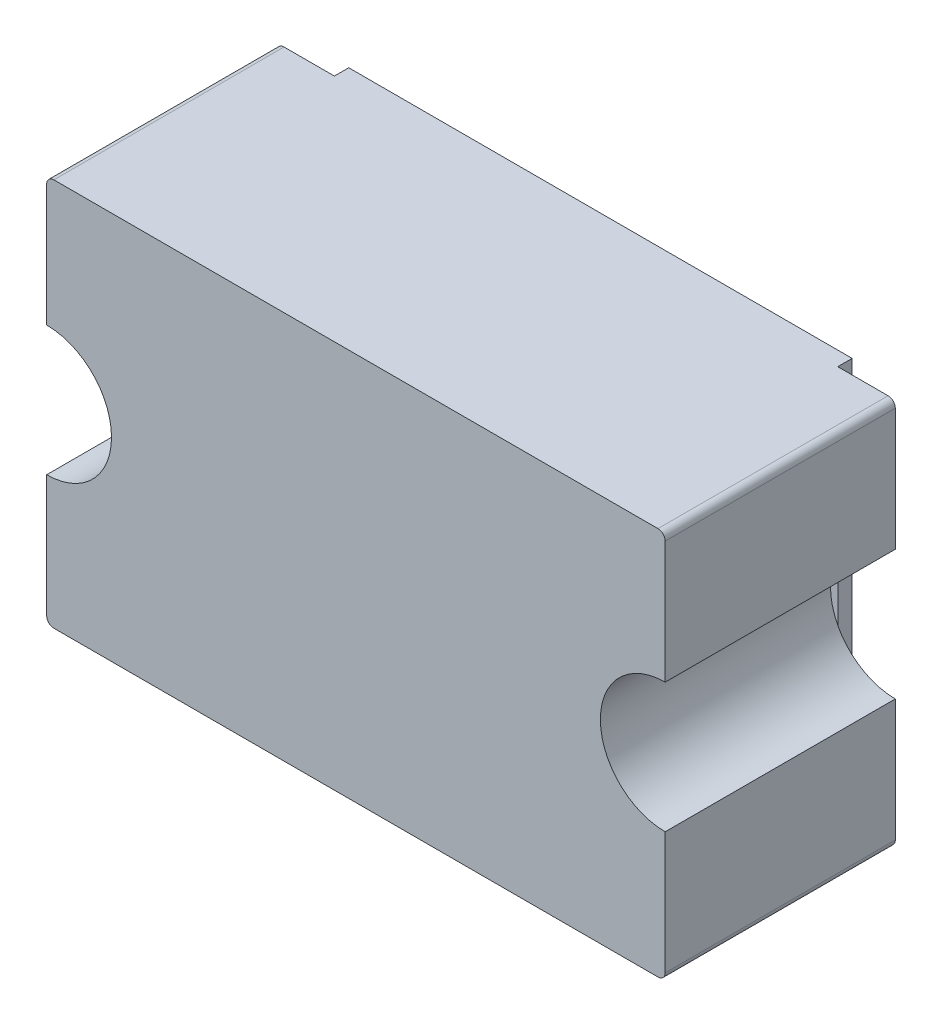
ISO-10303-21;
HEADER;
FILE_DESCRIPTION(('STEP AP214'),'2;1');
FILE_NAME('part.step','',(''),(''),'','','');
FILE_SCHEMA(('AUTOMOTIVE_DESIGN { 1 0 10303 214 1 1 1 1 }'));
ENDSEC;
DATA;
#1=APPLICATION_CONTEXT('core data for automotive mechanical design processes');
#2=APPLICATION_PROTOCOL_DEFINITION('international standard','automotive_design',2000,#1);
#3=PRODUCT_CONTEXT('',#1,'mechanical');
#4=PRODUCT('Part','Part','',(#3));
#5=PRODUCT_RELATED_PRODUCT_CATEGORY('part','',(#4));
#6=PRODUCT_DEFINITION_FORMATION('','',#4);
#7=PRODUCT_DEFINITION_CONTEXT('part definition',#1,'design');
#8=PRODUCT_DEFINITION('design','',#6,#7);
#9=PRODUCT_DEFINITION_SHAPE('','',#8);
#10=(LENGTH_UNIT() NAMED_UNIT(*) SI_UNIT(.MILLI.,.METRE.));
#11=(NAMED_UNIT(*) PLANE_ANGLE_UNIT() SI_UNIT($,.RADIAN.));
#12=(NAMED_UNIT(*) SI_UNIT($,.STERADIAN.) SOLID_ANGLE_UNIT());
#13=UNCERTAINTY_MEASURE_WITH_UNIT(LENGTH_MEASURE(1.E-05),#10,'distance_accuracy_value','');
#14=(GEOMETRIC_REPRESENTATION_CONTEXT(3) GLOBAL_UNCERTAINTY_ASSIGNED_CONTEXT((#13)) GLOBAL_UNIT_ASSIGNED_CONTEXT((#10,
#11,#12)) REPRESENTATION_CONTEXT('',''));
#15=CARTESIAN_POINT('',(0.,0.,0.));
#16=DIRECTION('',(0.,0.,1.));
#17=DIRECTION('',(1.,0.,0.));
#18=AXIS2_PLACEMENT_3D('',#15,#16,#17);
#19=CARTESIAN_POINT('',(0.,0.,0.05));
#20=DIRECTION('',(0.,0.,-1.));
#21=DIRECTION('',(-1.,0.,0.));
#22=AXIS2_PLACEMENT_3D('',#19,#20,#21);
#23=PLANE('',#22);
#24=CARTESIAN_POINT('',(1.075,0.,0.05));
#25=DIRECTION('',(0.,0.,-1.));
#26=DIRECTION('',(0.,-1.,0.));
#27=AXIS2_PLACEMENT_3D('',#24,#25,#26);
#28=CIRCLE('',#27,0.225230326829346);
#29=CARTESIAN_POINT('',(0.875,-0.103579438710846,0.05));
#30=VERTEX_POINT('',#29);
#31=CARTESIAN_POINT('',(0.875,0.103579438710846,0.05));
#32=VERTEX_POINT('',#31);
#33=EDGE_CURVE('E11',#30,#32,#28,.T.);
#34=ORIENTED_EDGE('',*,*,#33,.F.);
#35=DIRECTION('',(0.,-1.,0.));
#36=VECTOR('',#35,1.);
#37=CARTESIAN_POINT('',(0.875,0.675,0.05));
#38=LINE('',#37,#36);
#39=EDGE_CURVE('E24',#32,#30,#38,.T.);
#40=ORIENTED_EDGE('',*,*,#39,.F.);
#41=EDGE_LOOP('',(#34,#40));
#42=FACE_BOUND('',#41,.T.);
#43=ADVANCED_FACE('F17',(#42),#23,.F.);
#44=CARTESIAN_POINT('',(0.,0.,0.05));
#45=DIRECTION('',(0.,0.,-1.));
#46=DIRECTION('',(-1.,0.,0.));
#47=AXIS2_PLACEMENT_3D('',#44,#45,#46);
#48=PLANE('',#47);
#49=CARTESIAN_POINT('',(-1.075,0.,0.05));
#50=DIRECTION('',(0.,0.,-1.));
#51=DIRECTION('',(0.,1.,0.));
#52=AXIS2_PLACEMENT_3D('',#49,#50,#51);
#53=CIRCLE('',#52,0.225230326829346);
#54=CARTESIAN_POINT('',(-0.875,0.103579438710846,0.05));
#55=VERTEX_POINT('',#54);
#56=CARTESIAN_POINT('',(-0.875,-0.103579438710846,0.05));
#57=VERTEX_POINT('',#56);
#58=EDGE_CURVE('E300',#55,#57,#53,.T.);
#59=ORIENTED_EDGE('',*,*,#58,.F.);
#60=DIRECTION('',(0.,1.,0.));
#61=VECTOR('',#60,1.);
#62=CARTESIAN_POINT('',(-0.875,-0.675,0.05));
#63=LINE('',#62,#61);
#64=EDGE_CURVE('E297',#57,#55,#63,.T.);
#65=ORIENTED_EDGE('',*,*,#64,.F.);
#66=EDGE_LOOP('',(#59,#65));
#67=FACE_BOUND('',#66,.T.);
#68=ADVANCED_FACE('F355',(#67),#48,.F.);
#69=CARTESIAN_POINT('',(0.875,0.675,0.05));
#70=DIRECTION('',(1.,0.,0.));
#71=DIRECTION('',(0.,-1.,0.));
#72=AXIS2_PLACEMENT_3D('',#69,#70,#71);
#73=PLANE('',#72);
#74=DIRECTION('',(0.,1.,0.));
#75=VECTOR('',#74,1.);
#76=CARTESIAN_POINT('',(0.875,0.3375,0.));
#77=LINE('',#76,#75);
#78=CARTESIAN_POINT('',(0.875,-0.675,0.));
#79=VERTEX_POINT('',#78);
#80=CARTESIAN_POINT('',(0.875,0.675,0.));
#81=VERTEX_POINT('',#80);
#82=EDGE_CURVE('E295',#79,#81,#77,.T.);
#83=ORIENTED_EDGE('',*,*,#82,.T.);
#84=DIRECTION('',(0.,0.,-1.));
#85=VECTOR('',#84,1.);
#86=CARTESIAN_POINT('',(0.875,0.675,0.05));
#87=LINE('',#86,#85);
#88=CARTESIAN_POINT('',(0.875,0.675,0.05));
#89=VERTEX_POINT('',#88);
#90=EDGE_CURVE('E292',#89,#81,#87,.T.);
#91=ORIENTED_EDGE('',*,*,#90,.F.);
#92=DIRECTION('',(0.,1.,0.));
#93=VECTOR('',#92,1.);
#94=CARTESIAN_POINT('',(0.875,0.3375,0.05));
#95=LINE('',#94,#93);
#96=EDGE_CURVE('E289',#32,#89,#95,.T.);
#97=ORIENTED_EDGE('',*,*,#96,.F.);
#98=ORIENTED_EDGE('',*,*,#39,.T.);
#99=DIRECTION('',(0.,1.,0.));
#100=VECTOR('',#99,1.);
#101=CARTESIAN_POINT('',(0.875,0.3375,0.05));
#102=LINE('',#101,#100);
#103=CARTESIAN_POINT('',(0.875,-0.675,0.05));
#104=VERTEX_POINT('',#103);
#105=EDGE_CURVE('E286',#104,#30,#102,.T.);
#106=ORIENTED_EDGE('',*,*,#105,.F.);
#107=DIRECTION('',(0.,0.,-1.));
#108=VECTOR('',#107,1.);
#109=CARTESIAN_POINT('',(0.875,-0.675,0.05));
#110=LINE('',#109,#108);
#111=EDGE_CURVE('E283',#104,#79,#110,.T.);
#112=ORIENTED_EDGE('',*,*,#111,.T.);
#113=EDGE_LOOP('',(#83,#91,#97,#98,#106,#112));
#114=FACE_BOUND('',#113,.T.);
#115=ADVANCED_FACE('F303',(#114),#73,.T.);
#116=CARTESIAN_POINT('',(-0.875,-0.675,0.05));
#117=DIRECTION('',(-1.,0.,0.));
#118=DIRECTION('',(0.,1.,0.));
#119=AXIS2_PLACEMENT_3D('',#116,#117,#118);
#120=PLANE('',#119);
#121=DIRECTION('',(0.,-1.,0.));
#122=VECTOR('',#121,1.);
#123=CARTESIAN_POINT('',(-0.875,-0.3375,0.));
#124=LINE('',#123,#122);
#125=CARTESIAN_POINT('',(-0.875,0.675,0.));
#126=VERTEX_POINT('',#125);
#127=CARTESIAN_POINT('',(-0.875,-0.675,0.));
#128=VERTEX_POINT('',#127);
#129=EDGE_CURVE('E281',#126,#128,#124,.T.);
#130=ORIENTED_EDGE('',*,*,#129,.T.);
#131=DIRECTION('',(0.,0.,-1.));
#132=VECTOR('',#131,1.);
#133=CARTESIAN_POINT('',(-0.875,-0.675,0.05));
#134=LINE('',#133,#132);
#135=CARTESIAN_POINT('',(-0.875,-0.675,0.05));
#136=VERTEX_POINT('',#135);
#137=EDGE_CURVE('E278',#136,#128,#134,.T.);
#138=ORIENTED_EDGE('',*,*,#137,.F.);
#139=DIRECTION('',(0.,-1.,0.));
#140=VECTOR('',#139,1.);
#141=CARTESIAN_POINT('',(-0.875,-0.3375,0.05));
#142=LINE('',#141,#140);
#143=EDGE_CURVE('E275',#57,#136,#142,.T.);
#144=ORIENTED_EDGE('',*,*,#143,.F.);
#145=ORIENTED_EDGE('',*,*,#64,.T.);
#146=DIRECTION('',(0.,-1.,0.));
#147=VECTOR('',#146,1.);
#148=CARTESIAN_POINT('',(-0.875,-0.3375,0.05));
#149=LINE('',#148,#147);
#150=CARTESIAN_POINT('',(-0.875,0.675,0.05));
#151=VERTEX_POINT('',#150);
#152=EDGE_CURVE('E272',#151,#55,#149,.T.);
#153=ORIENTED_EDGE('',*,*,#152,.F.);
#154=DIRECTION('',(0.,0.,-1.));
#155=VECTOR('',#154,1.);
#156=CARTESIAN_POINT('',(-0.875,0.675,0.05));
#157=LINE('',#156,#155);
#158=EDGE_CURVE('E269',#151,#126,#157,.T.);
#159=ORIENTED_EDGE('',*,*,#158,.T.);
#160=EDGE_LOOP('',(#130,#138,#144,#145,#153,#159));
#161=FACE_BOUND('',#160,.T.);
#162=ADVANCED_FACE('F345',(#161),#120,.T.);
#163=CARTESIAN_POINT('',(0.,0.,0.));
#164=DIRECTION('',(0.,0.,-1.));
#165=DIRECTION('',(-1.,0.,0.));
#166=AXIS2_PLACEMENT_3D('',#163,#164,#165);
#167=PLANE('',#166);
#168=DIRECTION('',(-1.,0.,0.));
#169=VECTOR('',#168,1.);
#170=CARTESIAN_POINT('',(-0.4375,0.675,0.));
#171=LINE('',#170,#169);
#172=EDGE_CURVE('E266',#81,#126,#171,.T.);
#173=ORIENTED_EDGE('',*,*,#172,.F.);
#174=ORIENTED_EDGE('',*,*,#82,.F.);
#175=DIRECTION('',(1.,0.,0.));
#176=VECTOR('',#175,1.);
#177=CARTESIAN_POINT('',(0.4375,-0.675,0.));
#178=LINE('',#177,#176);
#179=EDGE_CURVE('E263',#128,#79,#178,.T.);
#180=ORIENTED_EDGE('',*,*,#179,.F.);
#181=ORIENTED_EDGE('',*,*,#129,.F.);
#182=EDGE_LOOP('',(#173,#174,#180,#181));
#183=FACE_BOUND('',#182,.T.);
#184=ADVANCED_FACE('F350',(#183),#167,.T.);
#185=CARTESIAN_POINT('',(0.,0.,0.05));
#186=DIRECTION('',(0.,0.,1.));
#187=DIRECTION('',(1.,0.,0.));
#188=AXIS2_PLACEMENT_3D('',#185,#186,#187);
#189=PLANE('',#188);
#190=ORIENTED_EDGE('',*,*,#105,.T.);
#191=CARTESIAN_POINT('',(1.075,0.,0.05));
#192=DIRECTION('',(0.,0.,-1.));
#193=DIRECTION('',(0.,-1.,0.));
#194=AXIS2_PLACEMENT_3D('',#191,#192,#193);
#195=CIRCLE('',#194,0.225230326829346);
#196=CARTESIAN_POINT('',(1.075,-0.225230326829346,0.05));
#197=VERTEX_POINT('',#196);
#198=EDGE_CURVE('E261',#197,#30,#195,.T.);
#199=ORIENTED_EDGE('',*,*,#198,.F.);
#200=DIRECTION('',(0.,1.,0.));
#201=VECTOR('',#200,1.);
#202=CARTESIAN_POINT('',(1.075,-0.65,0.05));
#203=LINE('',#202,#201);
#204=CARTESIAN_POINT('',(1.075,-0.65,0.05));
#205=VERTEX_POINT('',#204);
#206=EDGE_CURVE('E258',#205,#197,#203,.T.);
#207=ORIENTED_EDGE('',*,*,#206,.F.);
#208=CARTESIAN_POINT('',(1.05,-0.65,0.05));
#209=DIRECTION('',(0.,0.,1.));
#210=DIRECTION('',(0.,-1.,0.));
#211=AXIS2_PLACEMENT_3D('',#208,#209,#210);
#212=CIRCLE('',#211,0.025);
#213=CARTESIAN_POINT('',(1.05,-0.675,0.05));
#214=VERTEX_POINT('',#213);
#215=EDGE_CURVE('E256',#214,#205,#212,.T.);
#216=ORIENTED_EDGE('',*,*,#215,.F.);
#217=DIRECTION('',(1.,0.,0.));
#218=VECTOR('',#217,1.);
#219=CARTESIAN_POINT('',(-0.875,-0.675,0.05));
#220=LINE('',#219,#218);
#221=EDGE_CURVE('E159',#104,#214,#220,.T.);
#222=ORIENTED_EDGE('',*,*,#221,.F.);
#223=EDGE_LOOP('',(#190,#199,#207,#216,#222));
#224=FACE_BOUND('',#223,.T.);
#225=ADVANCED_FACE('F306',(#224),#189,.F.);
#226=CARTESIAN_POINT('',(0.,0.,0.05));
#227=DIRECTION('',(0.,0.,1.));
#228=DIRECTION('',(1.,0.,0.));
#229=AXIS2_PLACEMENT_3D('',#226,#227,#228);
#230=PLANE('',#229);
#231=ORIENTED_EDGE('',*,*,#96,.T.);
#232=DIRECTION('',(-1.,0.,0.));
#233=VECTOR('',#232,1.);
#234=CARTESIAN_POINT('',(0.875,0.675,0.05));
#235=LINE('',#234,#233);
#236=CARTESIAN_POINT('',(1.05,0.675,0.05));
#237=VERTEX_POINT('',#236);
#238=EDGE_CURVE('E252',#237,#89,#235,.T.);
#239=ORIENTED_EDGE('',*,*,#238,.F.);
#240=CARTESIAN_POINT('',(1.05,0.65,0.05));
#241=DIRECTION('',(0.,0.,1.));
#242=DIRECTION('',(1.,0.,0.));
#243=AXIS2_PLACEMENT_3D('',#240,#241,#242);
#244=CIRCLE('',#243,0.025);
#245=CARTESIAN_POINT('',(1.075,0.65,0.05));
#246=VERTEX_POINT('',#245);
#247=EDGE_CURVE('E249',#246,#237,#244,.T.);
#248=ORIENTED_EDGE('',*,*,#247,.F.);
#249=DIRECTION('',(0.,1.,0.));
#250=VECTOR('',#249,1.);
#251=CARTESIAN_POINT('',(1.075,0.225230326829346,0.05));
#252=LINE('',#251,#250);
#253=CARTESIAN_POINT('',(1.075,0.225230326829346,0.05));
#254=VERTEX_POINT('',#253);
#255=EDGE_CURVE('E246',#254,#246,#252,.T.);
#256=ORIENTED_EDGE('',*,*,#255,.F.);
#257=CARTESIAN_POINT('',(1.075,0.,0.05));
#258=DIRECTION('',(0.,0.,-1.));
#259=DIRECTION('',(0.,-1.,0.));
#260=AXIS2_PLACEMENT_3D('',#257,#258,#259);
#261=CIRCLE('',#260,0.225230326829346);
#262=EDGE_CURVE('E244',#32,#254,#261,.T.);
#263=ORIENTED_EDGE('',*,*,#262,.F.);
#264=EDGE_LOOP('',(#231,#239,#248,#256,#263));
#265=FACE_BOUND('',#264,.T.);
#266=ADVANCED_FACE('F317',(#265),#230,.F.);
#267=CARTESIAN_POINT('',(0.,0.,0.05));
#268=DIRECTION('',(0.,0.,1.));
#269=DIRECTION('',(1.,0.,0.));
#270=AXIS2_PLACEMENT_3D('',#267,#268,#269);
#271=PLANE('',#270);
#272=ORIENTED_EDGE('',*,*,#152,.T.);
#273=CARTESIAN_POINT('',(-1.075,0.,0.05));
#274=DIRECTION('',(0.,0.,-1.));
#275=DIRECTION('',(0.,1.,0.));
#276=AXIS2_PLACEMENT_3D('',#273,#274,#275);
#277=CIRCLE('',#276,0.225230326829346);
#278=CARTESIAN_POINT('',(-1.075,0.225230326829346,0.05));
#279=VERTEX_POINT('',#278);
#280=EDGE_CURVE('E241',#279,#55,#277,.T.);
#281=ORIENTED_EDGE('',*,*,#280,.F.);
#282=DIRECTION('',(0.,-1.,0.));
#283=VECTOR('',#282,1.);
#284=CARTESIAN_POINT('',(-1.075,0.65,0.05));
#285=LINE('',#284,#283);
#286=CARTESIAN_POINT('',(-1.075,0.65,0.05));
#287=VERTEX_POINT('',#286);
#288=EDGE_CURVE('E238',#287,#279,#285,.T.);
#289=ORIENTED_EDGE('',*,*,#288,.F.);
#290=CARTESIAN_POINT('',(-1.05,0.65,0.05));
#291=DIRECTION('',(0.,0.,1.));
#292=DIRECTION('',(0.,1.,0.));
#293=AXIS2_PLACEMENT_3D('',#290,#291,#292);
#294=CIRCLE('',#293,0.025);
#295=CARTESIAN_POINT('',(-1.05,0.675,0.05));
#296=VERTEX_POINT('',#295);
#297=EDGE_CURVE('E235',#296,#287,#294,.T.);
#298=ORIENTED_EDGE('',*,*,#297,.F.);
#299=DIRECTION('',(-1.,0.,0.));
#300=VECTOR('',#299,1.);
#301=CARTESIAN_POINT('',(0.875,0.675,0.05));
#302=LINE('',#301,#300);
#303=EDGE_CURVE('E232',#151,#296,#302,.T.);
#304=ORIENTED_EDGE('',*,*,#303,.F.);
#305=EDGE_LOOP('',(#272,#281,#289,#298,#304));
#306=FACE_BOUND('',#305,.T.);
#307=ADVANCED_FACE('F353',(#306),#271,.F.);
#308=CARTESIAN_POINT('',(0.,0.,0.05));
#309=DIRECTION('',(0.,0.,1.));
#310=DIRECTION('',(1.,0.,0.));
#311=AXIS2_PLACEMENT_3D('',#308,#309,#310);
#312=PLANE('',#311);
#313=ORIENTED_EDGE('',*,*,#143,.T.);
#314=DIRECTION('',(1.,0.,0.));
#315=VECTOR('',#314,1.);
#316=CARTESIAN_POINT('',(-0.875,-0.675,0.05));
#317=LINE('',#316,#315);
#318=CARTESIAN_POINT('',(-1.05,-0.675,0.05));
#319=VERTEX_POINT('',#318);
#320=EDGE_CURVE('E230',#319,#136,#317,.T.);
#321=ORIENTED_EDGE('',*,*,#320,.F.);
#322=CARTESIAN_POINT('',(-1.05,-0.65,0.05));
#323=DIRECTION('',(0.,0.,1.));
#324=DIRECTION('',(-1.,0.,0.));
#325=AXIS2_PLACEMENT_3D('',#322,#323,#324);
#326=CIRCLE('',#325,0.025);
#327=CARTESIAN_POINT('',(-1.075,-0.65,0.05));
#328=VERTEX_POINT('',#327);
#329=EDGE_CURVE('E227',#328,#319,#326,.T.);
#330=ORIENTED_EDGE('',*,*,#329,.F.);
#331=DIRECTION('',(0.,-1.,0.));
#332=VECTOR('',#331,1.);
#333=CARTESIAN_POINT('',(-1.075,-0.225230326829346,0.05));
#334=LINE('',#333,#332);
#335=CARTESIAN_POINT('',(-1.075,-0.225230326829346,0.05));
#336=VERTEX_POINT('',#335);
#337=EDGE_CURVE('E224',#336,#328,#334,.T.);
#338=ORIENTED_EDGE('',*,*,#337,.F.);
#339=CARTESIAN_POINT('',(-1.075,0.,0.05));
#340=DIRECTION('',(0.,0.,-1.));
#341=DIRECTION('',(0.,1.,0.));
#342=AXIS2_PLACEMENT_3D('',#339,#340,#341);
#343=CIRCLE('',#342,0.225230326829346);
#344=EDGE_CURVE('E221',#57,#336,#343,.T.);
#345=ORIENTED_EDGE('',*,*,#344,.F.);
#346=EDGE_LOOP('',(#313,#321,#330,#338,#345));
#347=FACE_BOUND('',#346,.T.);
#348=ADVANCED_FACE('F341',(#347),#312,.F.);
#349=CARTESIAN_POINT('',(-1.05,-0.65,0.05));
#350=DIRECTION('',(0.,0.,1.));
#351=DIRECTION('',(-1.,0.,0.));
#352=AXIS2_PLACEMENT_3D('',#349,#350,#351);
#353=CYLINDRICAL_SURFACE('',#352,0.025);
#354=ORIENTED_EDGE('',*,*,#329,.T.);
#355=DIRECTION('',(0.,0.,1.));
#356=VECTOR('',#355,1.);
#357=CARTESIAN_POINT('',(-1.05,-0.675,0.05));
#358=LINE('',#357,#356);
#359=CARTESIAN_POINT('',(-1.05,-0.675,0.85));
#360=VERTEX_POINT('',#359);
#361=EDGE_CURVE('E219',#319,#360,#358,.T.);
#362=ORIENTED_EDGE('',*,*,#361,.T.);
#363=CARTESIAN_POINT('',(-1.05,-0.65,0.85));
#364=DIRECTION('',(0.,0.,1.));
#365=DIRECTION('',(-1.,0.,0.));
#366=AXIS2_PLACEMENT_3D('',#363,#364,#365);
#367=CIRCLE('',#366,0.025);
#368=CARTESIAN_POINT('',(-1.075,-0.65,0.85));
#369=VERTEX_POINT('',#368);
#370=EDGE_CURVE('E164',#369,#360,#367,.T.);
#371=ORIENTED_EDGE('',*,*,#370,.F.);
#372=DIRECTION('',(0.,0.,1.));
#373=VECTOR('',#372,1.);
#374=CARTESIAN_POINT('',(-1.075,-0.65,0.05));
#375=LINE('',#374,#373);
#376=EDGE_CURVE('E215',#328,#369,#375,.T.);
#377=ORIENTED_EDGE('',*,*,#376,.F.);
#378=EDGE_LOOP('',(#354,#362,#371,#377));
#379=FACE_BOUND('',#378,.T.);
#380=ADVANCED_FACE('F338',(#379),#353,.T.);
#381=CARTESIAN_POINT('',(-1.075,-0.225230326829346,0.05));
#382=DIRECTION('',(-1.,0.,0.));
#383=DIRECTION('',(0.,-1.,0.));
#384=AXIS2_PLACEMENT_3D('',#381,#382,#383);
#385=PLANE('',#384);
#386=ORIENTED_EDGE('',*,*,#337,.T.);
#387=ORIENTED_EDGE('',*,*,#376,.T.);
#388=DIRECTION('',(0.,-1.,0.));
#389=VECTOR('',#388,1.);
#390=CARTESIAN_POINT('',(-1.075,-0.225230326829346,0.85));
#391=LINE('',#390,#389);
#392=CARTESIAN_POINT('',(-1.075,-0.225230326829346,0.85));
#393=VERTEX_POINT('',#392);
#394=EDGE_CURVE('E213',#393,#369,#391,.T.);
#395=ORIENTED_EDGE('',*,*,#394,.F.);
#396=DIRECTION('',(0.,0.,1.));
#397=VECTOR('',#396,1.);
#398=CARTESIAN_POINT('',(-1.075,-0.225230326829346,0.05));
#399=LINE('',#398,#397);
#400=EDGE_CURVE('E210',#336,#393,#399,.T.);
#401=ORIENTED_EDGE('',*,*,#400,.F.);
#402=EDGE_LOOP('',(#386,#387,#395,#401));
#403=FACE_BOUND('',#402,.T.);
#404=ADVANCED_FACE('F335',(#403),#385,.T.);
#405=CARTESIAN_POINT('',(-1.075,0.,0.05));
#406=DIRECTION('',(0.,0.,1.));
#407=DIRECTION('',(0.,1.,0.));
#408=AXIS2_PLACEMENT_3D('',#405,#406,#407);
#409=CYLINDRICAL_SURFACE('',#408,0.225230326829346);
#410=ORIENTED_EDGE('',*,*,#280,.T.);
#411=ORIENTED_EDGE('',*,*,#58,.T.);
#412=ORIENTED_EDGE('',*,*,#344,.T.);
#413=ORIENTED_EDGE('',*,*,#400,.T.);
#414=CARTESIAN_POINT('',(-1.075,0.,0.85));
#415=DIRECTION('',(0.,0.,-1.));
#416=DIRECTION('',(0.,1.,0.));
#417=AXIS2_PLACEMENT_3D('',#414,#415,#416);
#418=CIRCLE('',#417,0.225230326829346);
#419=CARTESIAN_POINT('',(-1.075,0.225230326829346,0.85));
#420=VERTEX_POINT('',#419);
#421=EDGE_CURVE('E207',#420,#393,#418,.T.);
#422=ORIENTED_EDGE('',*,*,#421,.F.);
#423=DIRECTION('',(0.,0.,1.));
#424=VECTOR('',#423,1.);
#425=CARTESIAN_POINT('',(-1.075,0.225230326829346,0.05));
#426=LINE('',#425,#424);
#427=EDGE_CURVE('E205',#279,#420,#426,.T.);
#428=ORIENTED_EDGE('',*,*,#427,.F.);
#429=EDGE_LOOP('',(#410,#411,#412,#413,#422,#428));
#430=FACE_BOUND('',#429,.T.);
#431=ADVANCED_FACE('F332',(#430),#409,.F.);
#432=CARTESIAN_POINT('',(-1.075,0.65,0.05));
#433=DIRECTION('',(-1.,0.,0.));
#434=DIRECTION('',(0.,-1.,0.));
#435=AXIS2_PLACEMENT_3D('',#432,#433,#434);
#436=PLANE('',#435);
#437=ORIENTED_EDGE('',*,*,#288,.T.);
#438=ORIENTED_EDGE('',*,*,#427,.T.);
#439=DIRECTION('',(0.,-1.,0.));
#440=VECTOR('',#439,1.);
#441=CARTESIAN_POINT('',(-1.075,0.65,0.85));
#442=LINE('',#441,#440);
#443=CARTESIAN_POINT('',(-1.075,0.65,0.85));
#444=VERTEX_POINT('',#443);
#445=EDGE_CURVE('E202',#444,#420,#442,.T.);
#446=ORIENTED_EDGE('',*,*,#445,.F.);
#447=DIRECTION('',(0.,0.,1.));
#448=VECTOR('',#447,1.);
#449=CARTESIAN_POINT('',(-1.075,0.65,0.05));
#450=LINE('',#449,#448);
#451=EDGE_CURVE('E199',#287,#444,#450,.T.);
#452=ORIENTED_EDGE('',*,*,#451,.F.);
#453=EDGE_LOOP('',(#437,#438,#446,#452));
#454=FACE_BOUND('',#453,.T.);
#455=ADVANCED_FACE('F328',(#454),#436,.T.);
#456=CARTESIAN_POINT('',(-1.05,0.65,0.05));
#457=DIRECTION('',(0.,0.,1.));
#458=DIRECTION('',(0.,1.,0.));
#459=AXIS2_PLACEMENT_3D('',#456,#457,#458);
#460=CYLINDRICAL_SURFACE('',#459,0.025);
#461=ORIENTED_EDGE('',*,*,#297,.T.);
#462=ORIENTED_EDGE('',*,*,#451,.T.);
#463=CARTESIAN_POINT('',(-1.05,0.65,0.85));
#464=DIRECTION('',(0.,0.,1.));
#465=DIRECTION('',(0.,1.,0.));
#466=AXIS2_PLACEMENT_3D('',#463,#464,#465);
#467=CIRCLE('',#466,0.025);
#468=CARTESIAN_POINT('',(-1.05,0.675,0.85));
#469=VERTEX_POINT('',#468);
#470=EDGE_CURVE('E196',#469,#444,#467,.T.);
#471=ORIENTED_EDGE('',*,*,#470,.F.);
#472=DIRECTION('',(0.,0.,1.));
#473=VECTOR('',#472,1.);
#474=CARTESIAN_POINT('',(-1.05,0.675,0.05));
#475=LINE('',#474,#473);
#476=EDGE_CURVE('E193',#296,#469,#475,.T.);
#477=ORIENTED_EDGE('',*,*,#476,.F.);
#478=EDGE_LOOP('',(#461,#462,#471,#477));
#479=FACE_BOUND('',#478,.T.);
#480=ADVANCED_FACE('F325',(#479),#460,.T.);
#481=CARTESIAN_POINT('',(1.05,0.675,0.05));
#482=DIRECTION('',(0.,1.,0.));
#483=DIRECTION('',(-1.,0.,0.));
#484=AXIS2_PLACEMENT_3D('',#481,#482,#483);
#485=PLANE('',#484);
#486=ORIENTED_EDGE('',*,*,#238,.T.);
#487=ORIENTED_EDGE('',*,*,#90,.T.);
#488=ORIENTED_EDGE('',*,*,#172,.T.);
#489=ORIENTED_EDGE('',*,*,#158,.F.);
#490=ORIENTED_EDGE('',*,*,#303,.T.);
#491=ORIENTED_EDGE('',*,*,#476,.T.);
#492=DIRECTION('',(-1.,0.,0.));
#493=VECTOR('',#492,1.);
#494=CARTESIAN_POINT('',(0.875,0.675,0.85));
#495=LINE('',#494,#493);
#496=CARTESIAN_POINT('',(1.05,0.675,0.85));
#497=VERTEX_POINT('',#496);
#498=EDGE_CURVE('E190',#497,#469,#495,.T.);
#499=ORIENTED_EDGE('',*,*,#498,.F.);
#500=DIRECTION('',(0.,0.,1.));
#501=VECTOR('',#500,1.);
#502=CARTESIAN_POINT('',(1.05,0.675,0.05));
#503=LINE('',#502,#501);
#504=EDGE_CURVE('E187',#237,#497,#503,.T.);
#505=ORIENTED_EDGE('',*,*,#504,.F.);
#506=EDGE_LOOP('',(#486,#487,#488,#489,#490,#491,#499,#505));
#507=FACE_BOUND('',#506,.T.);
#508=ADVANCED_FACE('F322',(#507),#485,.T.);
#509=CARTESIAN_POINT('',(1.05,0.65,0.05));
#510=DIRECTION('',(0.,0.,1.));
#511=DIRECTION('',(1.,0.,0.));
#512=AXIS2_PLACEMENT_3D('',#509,#510,#511);
#513=CYLINDRICAL_SURFACE('',#512,0.025);
#514=ORIENTED_EDGE('',*,*,#247,.T.);
#515=ORIENTED_EDGE('',*,*,#504,.T.);
#516=CARTESIAN_POINT('',(1.05,0.65,0.85));
#517=DIRECTION('',(0.,0.,1.));
#518=DIRECTION('',(1.,0.,0.));
#519=AXIS2_PLACEMENT_3D('',#516,#517,#518);
#520=CIRCLE('',#519,0.025);
#521=CARTESIAN_POINT('',(1.075,0.65,0.85));
#522=VERTEX_POINT('',#521);
#523=EDGE_CURVE('E184',#522,#497,#520,.T.);
#524=ORIENTED_EDGE('',*,*,#523,.F.);
#525=DIRECTION('',(0.,0.,1.));
#526=VECTOR('',#525,1.);
#527=CARTESIAN_POINT('',(1.075,0.65,0.05));
#528=LINE('',#527,#526);
#529=EDGE_CURVE('E181',#246,#522,#528,.T.);
#530=ORIENTED_EDGE('',*,*,#529,.F.);
#531=EDGE_LOOP('',(#514,#515,#524,#530));
#532=FACE_BOUND('',#531,.T.);
#533=ADVANCED_FACE('F319',(#532),#513,.T.);
#534=CARTESIAN_POINT('',(1.075,0.225230326829346,0.05));
#535=DIRECTION('',(1.,0.,0.));
#536=DIRECTION('',(0.,1.,0.));
#537=AXIS2_PLACEMENT_3D('',#534,#535,#536);
#538=PLANE('',#537);
#539=ORIENTED_EDGE('',*,*,#255,.T.);
#540=ORIENTED_EDGE('',*,*,#529,.T.);
#541=DIRECTION('',(0.,1.,0.));
#542=VECTOR('',#541,1.);
#543=CARTESIAN_POINT('',(1.075,0.225230326829346,0.85));
#544=LINE('',#543,#542);
#545=CARTESIAN_POINT('',(1.075,0.225230326829346,0.85));
#546=VERTEX_POINT('',#545);
#547=EDGE_CURVE('E178',#546,#522,#544,.T.);
#548=ORIENTED_EDGE('',*,*,#547,.F.);
#549=DIRECTION('',(0.,0.,1.));
#550=VECTOR('',#549,1.);
#551=CARTESIAN_POINT('',(1.075,0.225230326829346,0.05));
#552=LINE('',#551,#550);
#553=EDGE_CURVE('E175',#254,#546,#552,.T.);
#554=ORIENTED_EDGE('',*,*,#553,.F.);
#555=EDGE_LOOP('',(#539,#540,#548,#554));
#556=FACE_BOUND('',#555,.T.);
#557=ADVANCED_FACE('F314',(#556),#538,.T.);
#558=CARTESIAN_POINT('',(1.075,0.,0.05));
#559=DIRECTION('',(0.,0.,1.));
#560=DIRECTION('',(0.,-1.,0.));
#561=AXIS2_PLACEMENT_3D('',#558,#559,#560);
#562=CYLINDRICAL_SURFACE('',#561,0.225230326829346);
#563=ORIENTED_EDGE('',*,*,#198,.T.);
#564=ORIENTED_EDGE('',*,*,#33,.T.);
#565=ORIENTED_EDGE('',*,*,#262,.T.);
#566=ORIENTED_EDGE('',*,*,#553,.T.);
#567=CARTESIAN_POINT('',(1.075,0.,0.85));
#568=DIRECTION('',(0.,0.,-1.));
#569=DIRECTION('',(0.,-1.,0.));
#570=AXIS2_PLACEMENT_3D('',#567,#568,#569);
#571=CIRCLE('',#570,0.225230326829346);
#572=CARTESIAN_POINT('',(1.075,-0.225230326829346,0.85));
#573=VERTEX_POINT('',#572);
#574=EDGE_CURVE('E172',#573,#546,#571,.T.);
#575=ORIENTED_EDGE('',*,*,#574,.F.);
#576=DIRECTION('',(0.,0.,1.));
#577=VECTOR('',#576,1.);
#578=CARTESIAN_POINT('',(1.075,-0.225230326829346,0.05));
#579=LINE('',#578,#577);
#580=EDGE_CURVE('E170',#197,#573,#579,.T.);
#581=ORIENTED_EDGE('',*,*,#580,.F.);
#582=EDGE_LOOP('',(#563,#564,#565,#566,#575,#581));
#583=FACE_BOUND('',#582,.T.);
#584=ADVANCED_FACE('F308',(#583),#562,.F.);
#585=CARTESIAN_POINT('',(1.075,-0.65,0.05));
#586=DIRECTION('',(1.,0.,0.));
#587=DIRECTION('',(0.,1.,0.));
#588=AXIS2_PLACEMENT_3D('',#585,#586,#587);
#589=PLANE('',#588);
#590=ORIENTED_EDGE('',*,*,#206,.T.);
#591=ORIENTED_EDGE('',*,*,#580,.T.);
#592=DIRECTION('',(0.,1.,0.));
#593=VECTOR('',#592,1.);
#594=CARTESIAN_POINT('',(1.075,-0.65,0.85));
#595=LINE('',#594,#593);
#596=CARTESIAN_POINT('',(1.075,-0.65,0.85));
#597=VERTEX_POINT('',#596);
#598=EDGE_CURVE('E168',#597,#573,#595,.T.);
#599=ORIENTED_EDGE('',*,*,#598,.F.);
#600=DIRECTION('',(0.,0.,1.));
#601=VECTOR('',#600,1.);
#602=CARTESIAN_POINT('',(1.075,-0.65,0.05));
#603=LINE('',#602,#601);
#604=EDGE_CURVE('E145',#205,#597,#603,.T.);
#605=ORIENTED_EDGE('',*,*,#604,.F.);
#606=EDGE_LOOP('',(#590,#591,#599,#605));
#607=FACE_BOUND('',#606,.T.);
#608=ADVANCED_FACE('F311',(#607),#589,.T.);
#609=CARTESIAN_POINT('',(1.05,-0.65,0.05));
#610=DIRECTION('',(0.,0.,1.));
#611=DIRECTION('',(0.,-1.,0.));
#612=AXIS2_PLACEMENT_3D('',#609,#610,#611);
#613=CYLINDRICAL_SURFACE('',#612,0.025);
#614=ORIENTED_EDGE('',*,*,#215,.T.);
#615=ORIENTED_EDGE('',*,*,#604,.T.);
#616=CARTESIAN_POINT('',(1.05,-0.65,0.85));
#617=DIRECTION('',(0.,0.,1.));
#618=DIRECTION('',(0.,-1.,0.));
#619=AXIS2_PLACEMENT_3D('',#616,#617,#618);
#620=CIRCLE('',#619,0.025);
#621=CARTESIAN_POINT('',(1.05,-0.675,0.85));
#622=VERTEX_POINT('',#621);
#623=EDGE_CURVE('E139',#622,#597,#620,.T.);
#624=ORIENTED_EDGE('',*,*,#623,.F.);
#625=DIRECTION('',(0.,0.,1.));
#626=VECTOR('',#625,1.);
#627=CARTESIAN_POINT('',(1.05,-0.675,0.05));
#628=LINE('',#627,#626);
#629=EDGE_CURVE('E143',#214,#622,#628,.T.);
#630=ORIENTED_EDGE('',*,*,#629,.F.);
#631=EDGE_LOOP('',(#614,#615,#624,#630));
#632=FACE_BOUND('',#631,.T.);
#633=ADVANCED_FACE('F142',(#632),#613,.T.);
#634=CARTESIAN_POINT('',(-1.05,-0.675,0.05));
#635=DIRECTION('',(0.,-1.,0.));
#636=DIRECTION('',(1.,0.,0.));
#637=AXIS2_PLACEMENT_3D('',#634,#635,#636);
#638=PLANE('',#637);
#639=ORIENTED_EDGE('',*,*,#320,.T.);
#640=ORIENTED_EDGE('',*,*,#137,.T.);
#641=ORIENTED_EDGE('',*,*,#179,.T.);
#642=ORIENTED_EDGE('',*,*,#111,.F.);
#643=ORIENTED_EDGE('',*,*,#221,.T.);
#644=ORIENTED_EDGE('',*,*,#629,.T.);
#645=DIRECTION('',(1.,0.,0.));
#646=VECTOR('',#645,1.);
#647=CARTESIAN_POINT('',(-0.875,-0.675,0.85));
#648=LINE('',#647,#646);
#649=EDGE_CURVE('E156',#360,#622,#648,.T.);
#650=ORIENTED_EDGE('',*,*,#649,.F.);
#651=ORIENTED_EDGE('',*,*,#361,.F.);
#652=EDGE_LOOP('',(#639,#640,#641,#642,#643,#644,#650,#651));
#653=FACE_BOUND('',#652,.T.);
#654=ADVANCED_FACE('F154',(#653),#638,.T.);
#655=CARTESIAN_POINT('',(0.,0.,0.85));
#656=DIRECTION('',(0.,0.,1.));
#657=DIRECTION('',(1.,0.,0.));
#658=AXIS2_PLACEMENT_3D('',#655,#656,#657);
#659=PLANE('',#658);
#660=ORIENTED_EDGE('',*,*,#649,.T.);
#661=ORIENTED_EDGE('',*,*,#623,.T.);
#662=ORIENTED_EDGE('',*,*,#598,.T.);
#663=ORIENTED_EDGE('',*,*,#574,.T.);
#664=ORIENTED_EDGE('',*,*,#547,.T.);
#665=ORIENTED_EDGE('',*,*,#523,.T.);
#666=ORIENTED_EDGE('',*,*,#498,.T.);
#667=ORIENTED_EDGE('',*,*,#470,.T.);
#668=ORIENTED_EDGE('',*,*,#445,.T.);
#669=ORIENTED_EDGE('',*,*,#421,.T.);
#670=ORIENTED_EDGE('',*,*,#394,.T.);
#671=ORIENTED_EDGE('',*,*,#370,.T.);
#672=EDGE_LOOP('',(#660,#661,#662,#663,#664,#665,#666,#667,#668,#669,#670,#671));
#673=FACE_BOUND('',#672,.T.);
#674=ADVANCED_FACE('F162',(#673),#659,.T.);
#675=CLOSED_SHELL('',(#43,#68,#115,#162,#184,#225,#266,#307,#348,#380,#404,#431,#455,#480,#508,
#533,#557,#584,#608,#633,#654,#674));
#676=MANIFOLD_SOLID_BREP('B1',#675);
#677=ADVANCED_BREP_SHAPE_REPRESENTATION('',(#18,#676),#14);
#678=SHAPE_DEFINITION_REPRESENTATION(#9,#677);
ENDSEC;
END-ISO-10303-21;
